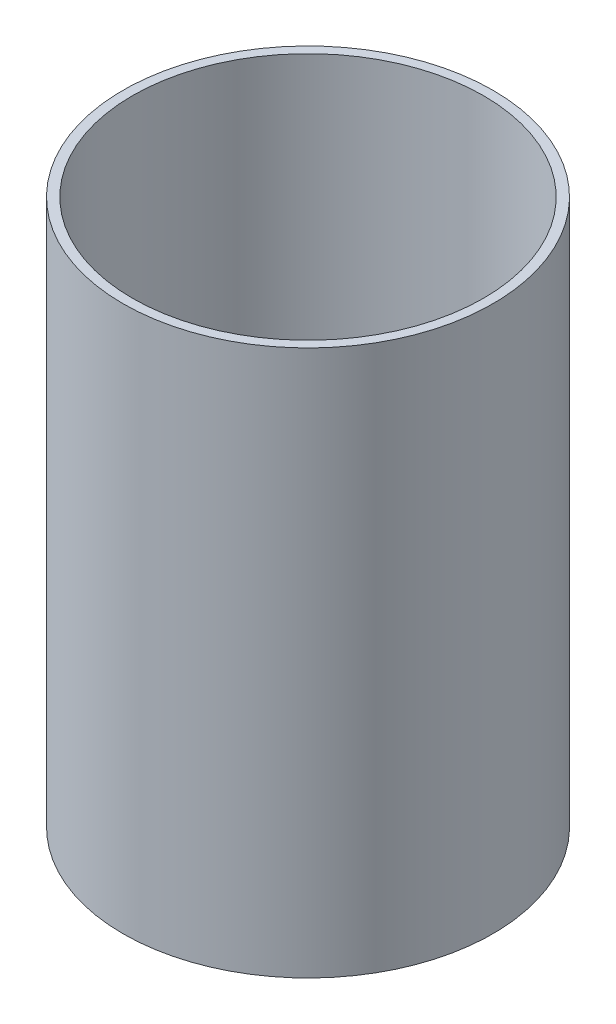
ISO-10303-21;
HEADER;
FILE_DESCRIPTION(('STEP AP214'),'2;1');
FILE_NAME('part.step','',(''),(''),'','','');
FILE_SCHEMA(('AUTOMOTIVE_DESIGN { 1 0 10303 214 1 1 1 1 }'));
ENDSEC;
DATA;
#1=APPLICATION_CONTEXT('core data for automotive mechanical design processes');
#2=APPLICATION_PROTOCOL_DEFINITION('international standard','automotive_design',2000,#1);
#3=PRODUCT_CONTEXT('',#1,'mechanical');
#4=PRODUCT('Part','Part','',(#3));
#5=PRODUCT_RELATED_PRODUCT_CATEGORY('part','',(#4));
#6=PRODUCT_DEFINITION_FORMATION('','',#4);
#7=PRODUCT_DEFINITION_CONTEXT('part definition',#1,'design');
#8=PRODUCT_DEFINITION('design','',#6,#7);
#9=PRODUCT_DEFINITION_SHAPE('','',#8);
#10=(LENGTH_UNIT() NAMED_UNIT(*) SI_UNIT(.MILLI.,.METRE.));
#11=(NAMED_UNIT(*) PLANE_ANGLE_UNIT() SI_UNIT($,.RADIAN.));
#12=(NAMED_UNIT(*) SI_UNIT($,.STERADIAN.) SOLID_ANGLE_UNIT());
#13=UNCERTAINTY_MEASURE_WITH_UNIT(LENGTH_MEASURE(1.E-05),#10,'distance_accuracy_value','');
#14=(GEOMETRIC_REPRESENTATION_CONTEXT(3) GLOBAL_UNCERTAINTY_ASSIGNED_CONTEXT((#13)) GLOBAL_UNIT_ASSIGNED_CONTEXT((#10,
#11,#12)) REPRESENTATION_CONTEXT('',''));
#15=CARTESIAN_POINT('',(0.,0.,0.));
#16=DIRECTION('',(0.,0.,1.));
#17=DIRECTION('',(1.,0.,0.));
#18=AXIS2_PLACEMENT_3D('',#15,#16,#17);
#19=CARTESIAN_POINT('',(0.,144.7292,0.));
#20=DIRECTION('',(0.,1.,0.));
#21=DIRECTION('',(0.,0.,1.));
#22=AXIS2_PLACEMENT_3D('',#19,#20,#21);
#23=PLANE('',#22);
#24=CARTESIAN_POINT('',(0.,144.7292,0.));
#25=DIRECTION('',(0.,1.,0.));
#26=DIRECTION('',(0.,0.,1.));
#27=AXIS2_PLACEMENT_3D('',#24,#25,#26);
#28=CIRCLE('',#27,49.911);
#29=CARTESIAN_POINT('',(0.,144.7292,49.911));
#30=VERTEX_POINT('',#29);
#31=EDGE_CURVE('E10',#30,#30,#28,.T.);
#32=ORIENTED_EDGE('',*,*,#31,.T.);
#33=EDGE_LOOP('',(#32));
#34=FACE_BOUND('',#33,.T.);
#35=CARTESIAN_POINT('',(0.,144.7292,0.));
#36=DIRECTION('',(0.,1.,0.));
#37=DIRECTION('',(0.,0.,1.));
#38=AXIS2_PLACEMENT_3D('',#35,#36,#37);
#39=CIRCLE('',#38,47.371);
#40=CARTESIAN_POINT('',(0.,144.7292,47.371));
#41=VERTEX_POINT('',#40);
#42=EDGE_CURVE('E46',#41,#41,#39,.T.);
#43=ORIENTED_EDGE('',*,*,#42,.F.);
#44=EDGE_LOOP('',(#43));
#45=FACE_BOUND('',#44,.T.);
#46=ADVANCED_FACE('F39',(#34,#45),#23,.T.);
#47=CARTESIAN_POINT('',(0.,144.7292,0.));
#48=DIRECTION('',(0.,-1.,0.));
#49=DIRECTION('',(0.,0.,-1.));
#50=AXIS2_PLACEMENT_3D('',#47,#48,#49);
#51=CYLINDRICAL_SURFACE('',#50,49.911);
#52=ORIENTED_EDGE('',*,*,#31,.F.);
#53=EDGE_LOOP('',(#52));
#54=FACE_BOUND('',#53,.T.);
#55=CARTESIAN_POINT('',(0.,-2.54,0.));
#56=DIRECTION('',(0.,-1.,0.));
#57=DIRECTION('',(0.,0.,-1.));
#58=AXIS2_PLACEMENT_3D('',#55,#56,#57);
#59=CIRCLE('',#58,49.911);
#60=CARTESIAN_POINT('',(0.,-2.54,-49.911));
#61=VERTEX_POINT('',#60);
#62=EDGE_CURVE('E55',#61,#61,#59,.T.);
#63=ORIENTED_EDGE('',*,*,#62,.F.);
#64=EDGE_LOOP('',(#63));
#65=FACE_BOUND('',#64,.T.);
#66=ADVANCED_FACE('F41',(#54,#65),#51,.T.);
#67=CARTESIAN_POINT('',(0.,144.7292,0.));
#68=DIRECTION('',(0.,-1.,0.));
#69=DIRECTION('',(0.,0.,-1.));
#70=AXIS2_PLACEMENT_3D('',#67,#68,#69);
#71=CYLINDRICAL_SURFACE('',#70,47.371);
#72=ORIENTED_EDGE('',*,*,#42,.T.);
#73=EDGE_LOOP('',(#72));
#74=FACE_BOUND('',#73,.T.);
#75=CARTESIAN_POINT('',(0.,0.,0.));
#76=DIRECTION('',(0.,1.,0.));
#77=DIRECTION('',(0.,0.,1.));
#78=AXIS2_PLACEMENT_3D('',#75,#76,#77);
#79=CIRCLE('',#78,47.371);
#80=CARTESIAN_POINT('',(0.,0.,47.371));
#81=VERTEX_POINT('',#80);
#82=EDGE_CURVE('E50',#81,#81,#79,.T.);
#83=ORIENTED_EDGE('',*,*,#82,.F.);
#84=EDGE_LOOP('',(#83));
#85=FACE_BOUND('',#84,.T.);
#86=ADVANCED_FACE('F63',(#74,#85),#71,.F.);
#87=CARTESIAN_POINT('',(0.,0.,0.));
#88=DIRECTION('',(0.,-1.,0.));
#89=DIRECTION('',(0.,0.,-1.));
#90=AXIS2_PLACEMENT_3D('',#87,#88,#89);
#91=PLANE('',#90);
#92=ORIENTED_EDGE('',*,*,#82,.T.);
#93=EDGE_LOOP('',(#92));
#94=FACE_BOUND('',#93,.T.);
#95=ADVANCED_FACE('F69',(#94),#91,.F.);
#96=CARTESIAN_POINT('',(0.,-2.54,0.));
#97=DIRECTION('',(0.,-1.,0.));
#98=DIRECTION('',(0.,0.,-1.));
#99=AXIS2_PLACEMENT_3D('',#96,#97,#98);
#100=PLANE('',#99);
#101=ORIENTED_EDGE('',*,*,#62,.T.);
#102=EDGE_LOOP('',(#101));
#103=FACE_BOUND('',#102,.T.);
#104=ADVANCED_FACE('F60',(#103),#100,.T.);
#105=CLOSED_SHELL('',(#46,#66,#86,#95,#104));
#106=MANIFOLD_SOLID_BREP('B2',#105);
#107=ADVANCED_BREP_SHAPE_REPRESENTATION('',(#18,#106),#14);
#108=SHAPE_DEFINITION_REPRESENTATION(#9,#107);
ENDSEC;
END-ISO-10303-21;
